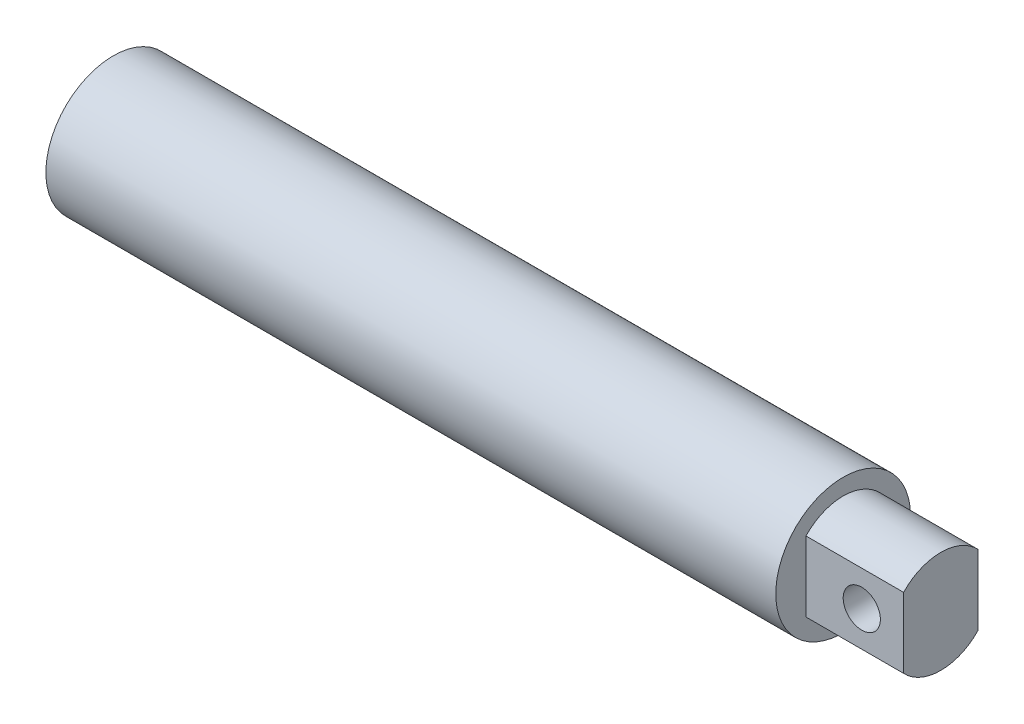
ISO-10303-21;
HEADER;
FILE_DESCRIPTION(('STEP AP214'),'2;1');
FILE_NAME('part.step','',(''),(''),'','','');
FILE_SCHEMA(('AUTOMOTIVE_DESIGN { 1 0 10303 214 1 1 1 1 }'));
ENDSEC;
DATA;
#1=APPLICATION_CONTEXT('core data for automotive mechanical design processes');
#2=APPLICATION_PROTOCOL_DEFINITION('international standard','automotive_design',2000,#1);
#3=PRODUCT_CONTEXT('',#1,'mechanical');
#4=PRODUCT('Part','Part','',(#3));
#5=PRODUCT_RELATED_PRODUCT_CATEGORY('part','',(#4));
#6=PRODUCT_DEFINITION_FORMATION('','',#4);
#7=PRODUCT_DEFINITION_CONTEXT('part definition',#1,'design');
#8=PRODUCT_DEFINITION('design','',#6,#7);
#9=PRODUCT_DEFINITION_SHAPE('','',#8);
#10=(LENGTH_UNIT() NAMED_UNIT(*) SI_UNIT(.MILLI.,.METRE.));
#11=(NAMED_UNIT(*) PLANE_ANGLE_UNIT() SI_UNIT($,.RADIAN.));
#12=(NAMED_UNIT(*) SI_UNIT($,.STERADIAN.) SOLID_ANGLE_UNIT());
#13=UNCERTAINTY_MEASURE_WITH_UNIT(LENGTH_MEASURE(1.E-05),#10,'distance_accuracy_value','');
#14=(GEOMETRIC_REPRESENTATION_CONTEXT(3) GLOBAL_UNCERTAINTY_ASSIGNED_CONTEXT((#13)) GLOBAL_UNIT_ASSIGNED_CONTEXT((#10,
#11,#12)) REPRESENTATION_CONTEXT('',''));
#15=CARTESIAN_POINT('',(0.,0.,0.));
#16=DIRECTION('',(0.,0.,1.));
#17=DIRECTION('',(1.,0.,0.));
#18=AXIS2_PLACEMENT_3D('',#15,#16,#17);
#19=CARTESIAN_POINT('',(157.,0.,0.));
#20=DIRECTION('',(1.,0.,0.));
#21=DIRECTION('',(0.,0.,-1.));
#22=AXIS2_PLACEMENT_3D('',#19,#20,#21);
#23=PLANE('',#22);
#24=CARTESIAN_POINT('',(157.,0.,0.));
#25=DIRECTION('',(1.,0.,0.));
#26=DIRECTION('',(0.,0.,-1.));
#27=AXIS2_PLACEMENT_3D('',#24,#25,#26);
#28=CIRCLE('',#27,14.5);
#29=CARTESIAN_POINT('',(157.,0.,-14.5));
#30=VERTEX_POINT('',#29);
#31=EDGE_CURVE('E11',#30,#30,#28,.T.);
#32=ORIENTED_EDGE('',*,*,#31,.T.);
#33=EDGE_LOOP('',(#32));
#34=FACE_BOUND('',#33,.T.);
#35=DIRECTION('',(0.,1.,0.));
#36=VECTOR('',#35,1.);
#37=CARTESIAN_POINT('',(157.,-7.54983443527074,-8.));
#38=LINE('',#37,#36);
#39=CARTESIAN_POINT('',(157.,-7.54983443527074,-8.));
#40=VERTEX_POINT('',#39);
#41=CARTESIAN_POINT('',(157.,7.54983443527074,-8.));
#42=VERTEX_POINT('',#41);
#43=EDGE_CURVE('E91',#40,#42,#38,.T.);
#44=ORIENTED_EDGE('',*,*,#43,.F.);
#45=CARTESIAN_POINT('',(157.,0.,0.));
#46=DIRECTION('',(1.,0.,0.));
#47=DIRECTION('',(0.,0.,-1.));
#48=AXIS2_PLACEMENT_3D('',#45,#46,#47);
#49=CIRCLE('',#48,11.);
#50=CARTESIAN_POINT('',(157.,-7.54983443527075,8.));
#51=VERTEX_POINT('',#50);
#52=EDGE_CURVE('E102',#51,#40,#49,.T.);
#53=ORIENTED_EDGE('',*,*,#52,.F.);
#54=DIRECTION('',(0.,-1.,0.));
#55=VECTOR('',#54,1.);
#56=CARTESIAN_POINT('',(157.,7.54983443527075,8.));
#57=LINE('',#56,#55);
#58=CARTESIAN_POINT('',(157.,7.54983443527075,8.));
#59=VERTEX_POINT('',#58);
#60=EDGE_CURVE('E72',#59,#51,#57,.T.);
#61=ORIENTED_EDGE('',*,*,#60,.F.);
#62=CARTESIAN_POINT('',(157.,0.,0.));
#63=DIRECTION('',(1.,0.,0.));
#64=DIRECTION('',(0.,0.,-1.));
#65=AXIS2_PLACEMENT_3D('',#62,#63,#64);
#66=CIRCLE('',#65,11.);
#67=EDGE_CURVE('E107',#42,#59,#66,.T.);
#68=ORIENTED_EDGE('',*,*,#67,.F.);
#69=EDGE_LOOP('',(#44,#53,#61,#68));
#70=FACE_BOUND('',#69,.T.);
#71=ADVANCED_FACE('F35',(#34,#70),#23,.T.);
#72=CARTESIAN_POINT('',(157.,0.,0.));
#73=DIRECTION('',(-1.,0.,0.));
#74=DIRECTION('',(0.,0.,1.));
#75=AXIS2_PLACEMENT_3D('',#72,#73,#74);
#76=CYLINDRICAL_SURFACE('',#75,14.5);
#77=ORIENTED_EDGE('',*,*,#31,.F.);
#78=EDGE_LOOP('',(#77));
#79=FACE_BOUND('',#78,.T.);
#80=CARTESIAN_POINT('',(0.,0.,0.));
#81=DIRECTION('',(1.,0.,0.));
#82=DIRECTION('',(0.,0.,-1.));
#83=AXIS2_PLACEMENT_3D('',#80,#81,#82);
#84=CIRCLE('',#83,14.5);
#85=CARTESIAN_POINT('',(0.,0.,-14.5));
#86=VERTEX_POINT('',#85);
#87=EDGE_CURVE('E39',#86,#86,#84,.T.);
#88=ORIENTED_EDGE('',*,*,#87,.T.);
#89=EDGE_LOOP('',(#88));
#90=FACE_BOUND('',#89,.T.);
#91=ADVANCED_FACE('F37',(#79,#90),#76,.T.);
#92=CARTESIAN_POINT('',(0.,0.,0.));
#93=DIRECTION('',(1.,0.,0.));
#94=DIRECTION('',(0.,0.,-1.));
#95=AXIS2_PLACEMENT_3D('',#92,#93,#94);
#96=PLANE('',#95);
#97=CARTESIAN_POINT('',(0.,0.,0.));
#98=DIRECTION('',(-1.,0.,0.));
#99=DIRECTION('',(0.,0.,1.));
#100=AXIS2_PLACEMENT_3D('',#97,#98,#99);
#101=CIRCLE('',#100,4.);
#102=CARTESIAN_POINT('',(0.,0.,4.));
#103=VERTEX_POINT('',#102);
#104=EDGE_CURVE('E163',#103,#103,#101,.T.);
#105=ORIENTED_EDGE('',*,*,#104,.F.);
#106=EDGE_LOOP('',(#105));
#107=FACE_BOUND('',#106,.T.);
#108=ORIENTED_EDGE('',*,*,#87,.F.);
#109=EDGE_LOOP('',(#108));
#110=FACE_BOUND('',#109,.T.);
#111=ADVANCED_FACE('F116',(#107,#110),#96,.F.);
#112=CARTESIAN_POINT('',(178.,0.,0.));
#113=DIRECTION('',(-1.,0.,0.));
#114=DIRECTION('',(0.,0.,1.));
#115=AXIS2_PLACEMENT_3D('',#112,#113,#114);
#116=CYLINDRICAL_SURFACE('',#115,11.);
#117=ORIENTED_EDGE('',*,*,#52,.T.);
#118=DIRECTION('',(-1.,0.,0.));
#119=VECTOR('',#118,1.);
#120=CARTESIAN_POINT('',(178.,-7.54983443527074,-8.));
#121=LINE('',#120,#119);
#122=CARTESIAN_POINT('',(178.,-7.54983443527074,-8.));
#123=VERTEX_POINT('',#122);
#124=EDGE_CURVE('E94',#123,#40,#121,.T.);
#125=ORIENTED_EDGE('',*,*,#124,.F.);
#126=CARTESIAN_POINT('',(178.,0.,0.));
#127=DIRECTION('',(1.,0.,0.));
#128=DIRECTION('',(0.,0.,-1.));
#129=AXIS2_PLACEMENT_3D('',#126,#127,#128);
#130=CIRCLE('',#129,11.);
#131=CARTESIAN_POINT('',(178.,-7.54983443527075,8.));
#132=VERTEX_POINT('',#131);
#133=EDGE_CURVE('E84',#132,#123,#130,.T.);
#134=ORIENTED_EDGE('',*,*,#133,.F.);
#135=DIRECTION('',(-1.,0.,0.));
#136=VECTOR('',#135,1.);
#137=CARTESIAN_POINT('',(178.,-7.54983443527075,8.));
#138=LINE('',#137,#136);
#139=EDGE_CURVE('E98',#132,#51,#138,.T.);
#140=ORIENTED_EDGE('',*,*,#139,.T.);
#141=EDGE_LOOP('',(#117,#125,#134,#140));
#142=FACE_BOUND('',#141,.T.);
#143=ADVANCED_FACE('F118',(#142),#116,.T.);
#144=CARTESIAN_POINT('',(178.,-7.54983443527074,-8.));
#145=DIRECTION('',(0.,0.,1.));
#146=DIRECTION('',(1.,0.,0.));
#147=AXIS2_PLACEMENT_3D('',#144,#145,#146);
#148=PLANE('',#147);
#149=CARTESIAN_POINT('',(169.,0.,-8.));
#150=DIRECTION('',(0.,0.,1.));
#151=DIRECTION('',(1.,0.,0.));
#152=AXIS2_PLACEMENT_3D('',#149,#150,#151);
#153=CIRCLE('',#152,3.99999999999999);
#154=CARTESIAN_POINT('',(173.,0.,-8.));
#155=VERTEX_POINT('',#154);
#156=EDGE_CURVE('E105',#155,#155,#153,.T.);
#157=ORIENTED_EDGE('',*,*,#156,.T.);
#158=EDGE_LOOP('',(#157));
#159=FACE_BOUND('',#158,.T.);
#160=ORIENTED_EDGE('',*,*,#43,.T.);
#161=DIRECTION('',(-1.,0.,0.));
#162=VECTOR('',#161,1.);
#163=CARTESIAN_POINT('',(178.,7.54983443527074,-8.));
#164=LINE('',#163,#162);
#165=CARTESIAN_POINT('',(178.,7.54983443527074,-8.));
#166=VERTEX_POINT('',#165);
#167=EDGE_CURVE('E88',#166,#42,#164,.T.);
#168=ORIENTED_EDGE('',*,*,#167,.F.);
#169=DIRECTION('',(0.,1.,0.));
#170=VECTOR('',#169,1.);
#171=CARTESIAN_POINT('',(178.,-7.54983443527074,-8.));
#172=LINE('',#171,#170);
#173=EDGE_CURVE('E79',#123,#166,#172,.T.);
#174=ORIENTED_EDGE('',*,*,#173,.F.);
#175=ORIENTED_EDGE('',*,*,#124,.T.);
#176=EDGE_LOOP('',(#160,#168,#174,#175));
#177=FACE_BOUND('',#176,.T.);
#178=ADVANCED_FACE('F89',(#159,#177),#148,.F.);
#179=CARTESIAN_POINT('',(178.,0.,0.));
#180=DIRECTION('',(-1.,0.,0.));
#181=DIRECTION('',(0.,0.,1.));
#182=AXIS2_PLACEMENT_3D('',#179,#180,#181);
#183=CYLINDRICAL_SURFACE('',#182,11.);
#184=ORIENTED_EDGE('',*,*,#67,.T.);
#185=DIRECTION('',(-1.,0.,0.));
#186=VECTOR('',#185,1.);
#187=CARTESIAN_POINT('',(178.,7.54983443527075,8.));
#188=LINE('',#187,#186);
#189=CARTESIAN_POINT('',(178.,7.54983443527075,8.));
#190=VERTEX_POINT('',#189);
#191=EDGE_CURVE('E50',#190,#59,#188,.T.);
#192=ORIENTED_EDGE('',*,*,#191,.F.);
#193=CARTESIAN_POINT('',(178.,0.,0.));
#194=DIRECTION('',(1.,0.,0.));
#195=DIRECTION('',(0.,0.,-1.));
#196=AXIS2_PLACEMENT_3D('',#193,#194,#195);
#197=CIRCLE('',#196,11.);
#198=EDGE_CURVE('E82',#166,#190,#197,.T.);
#199=ORIENTED_EDGE('',*,*,#198,.F.);
#200=ORIENTED_EDGE('',*,*,#167,.T.);
#201=EDGE_LOOP('',(#184,#192,#199,#200));
#202=FACE_BOUND('',#201,.T.);
#203=ADVANCED_FACE('F96',(#202),#183,.T.);
#204=CARTESIAN_POINT('',(178.,7.54983443527075,8.));
#205=DIRECTION('',(0.,0.,-1.));
#206=DIRECTION('',(-1.,0.,0.));
#207=AXIS2_PLACEMENT_3D('',#204,#205,#206);
#208=PLANE('',#207);
#209=CARTESIAN_POINT('',(169.,0.,8.));
#210=DIRECTION('',(0.,0.,1.));
#211=DIRECTION('',(1.,0.,0.));
#212=AXIS2_PLACEMENT_3D('',#209,#210,#211);
#213=CIRCLE('',#212,3.99999999999999);
#214=CARTESIAN_POINT('',(173.,0.,8.));
#215=VERTEX_POINT('',#214);
#216=EDGE_CURVE('E162',#215,#215,#213,.T.);
#217=ORIENTED_EDGE('',*,*,#216,.F.);
#218=EDGE_LOOP('',(#217));
#219=FACE_BOUND('',#218,.T.);
#220=ORIENTED_EDGE('',*,*,#60,.T.);
#221=ORIENTED_EDGE('',*,*,#139,.F.);
#222=DIRECTION('',(0.,-1.,0.));
#223=VECTOR('',#222,1.);
#224=CARTESIAN_POINT('',(178.,7.54983443527075,8.));
#225=LINE('',#224,#223);
#226=EDGE_CURVE('E58',#190,#132,#225,.T.);
#227=ORIENTED_EDGE('',*,*,#226,.F.);
#228=ORIENTED_EDGE('',*,*,#191,.T.);
#229=EDGE_LOOP('',(#220,#221,#227,#228));
#230=FACE_BOUND('',#229,.T.);
#231=ADVANCED_FACE('F140',(#219,#230),#208,.F.);
#232=CARTESIAN_POINT('',(178.,0.,0.));
#233=DIRECTION('',(1.,0.,0.));
#234=DIRECTION('',(0.,0.,-1.));
#235=AXIS2_PLACEMENT_3D('',#232,#233,#234);
#236=PLANE('',#235);
#237=ORIENTED_EDGE('',*,*,#133,.T.);
#238=ORIENTED_EDGE('',*,*,#173,.T.);
#239=ORIENTED_EDGE('',*,*,#198,.T.);
#240=ORIENTED_EDGE('',*,*,#226,.T.);
#241=EDGE_LOOP('',(#237,#238,#239,#240));
#242=FACE_BOUND('',#241,.T.);
#243=ADVANCED_FACE('F80',(#242),#236,.T.);
#244=CARTESIAN_POINT('',(169.,0.,-13.));
#245=DIRECTION('',(0.,0.,1.));
#246=DIRECTION('',(1.,0.,0.));
#247=AXIS2_PLACEMENT_3D('',#244,#245,#246);
#248=CYLINDRICAL_SURFACE('',#247,3.99999999999999);
#249=CARTESIAN_POINT('',(173.,0.,8.));
#250=CARTESIAN_POINT('',(173.,0.,7.83333333333333));
#251=CARTESIAN_POINT('',(173.,0.,7.66666666666667));
#252=CARTESIAN_POINT('',(173.,0.,7.33333333333333));
#253=CARTESIAN_POINT('',(173.,0.,7.16666666666667));
#254=CARTESIAN_POINT('',(173.,0.,6.83333333333333));
#255=CARTESIAN_POINT('',(173.,0.,6.66666666666667));
#256=CARTESIAN_POINT('',(173.,0.,6.33333333333333));
#257=CARTESIAN_POINT('',(173.,0.,6.16666666666667));
#258=CARTESIAN_POINT('',(173.,0.,5.83333333333333));
#259=CARTESIAN_POINT('',(173.,0.,5.66666666666667));
#260=CARTESIAN_POINT('',(173.,0.,5.33333333333333));
#261=CARTESIAN_POINT('',(173.,0.,5.16666666666667));
#262=CARTESIAN_POINT('',(173.,0.,4.83333333333333));
#263=CARTESIAN_POINT('',(173.,0.,4.66666666666667));
#264=CARTESIAN_POINT('',(173.,0.,4.33333333333333));
#265=CARTESIAN_POINT('',(173.,0.,4.16666666666667));
#266=CARTESIAN_POINT('',(173.,0.,3.83333333333333));
#267=CARTESIAN_POINT('',(173.,0.,3.66666666666666));
#268=CARTESIAN_POINT('',(173.,0.,3.33333333333333));
#269=CARTESIAN_POINT('',(173.,0.,3.16666666666666));
#270=CARTESIAN_POINT('',(173.,0.,2.83333333333333));
#271=CARTESIAN_POINT('',(173.,0.,2.66666666666667));
#272=CARTESIAN_POINT('',(173.,0.,2.33333333333334));
#273=CARTESIAN_POINT('',(173.,0.,2.16666666666667));
#274=CARTESIAN_POINT('',(173.,0.,1.83333333333334));
#275=CARTESIAN_POINT('',(173.,0.,1.66666666666667));
#276=CARTESIAN_POINT('',(173.,0.,1.33333333333333));
#277=CARTESIAN_POINT('',(173.,0.,1.16666666666667));
#278=CARTESIAN_POINT('',(173.,0.,0.833333333333334));
#279=CARTESIAN_POINT('',(173.,0.,0.666666666666667));
#280=CARTESIAN_POINT('',(173.,0.,0.333333333333334));
#281=CARTESIAN_POINT('',(173.,0.,0.166666666666667));
#282=CARTESIAN_POINT('',(173.,0.,-0.166666666666667));
#283=CARTESIAN_POINT('',(173.,0.,-0.333333333333334));
#284=CARTESIAN_POINT('',(173.,0.,-0.666666666666667));
#285=CARTESIAN_POINT('',(173.,0.,-0.833333333333334));
#286=CARTESIAN_POINT('',(173.,0.,-1.16666666666667));
#287=CARTESIAN_POINT('',(173.,0.,-1.33333333333333));
#288=CARTESIAN_POINT('',(173.,0.,-1.66666666666667));
#289=CARTESIAN_POINT('',(173.,0.,-1.83333333333334));
#290=CARTESIAN_POINT('',(173.,0.,-2.16666666666667));
#291=CARTESIAN_POINT('',(173.,0.,-2.33333333333333));
#292=CARTESIAN_POINT('',(173.,0.,-2.66666666666667));
#293=CARTESIAN_POINT('',(173.,0.,-2.83333333333333));
#294=CARTESIAN_POINT('',(173.,0.,-3.16666666666667));
#295=CARTESIAN_POINT('',(173.,0.,-3.33333333333333));
#296=CARTESIAN_POINT('',(173.,0.,-3.66666666666667));
#297=CARTESIAN_POINT('',(173.,0.,-3.83333333333333));
#298=CARTESIAN_POINT('',(173.,0.,-4.16666666666667));
#299=CARTESIAN_POINT('',(173.,0.,-4.33333333333334));
#300=CARTESIAN_POINT('',(173.,0.,-4.66666666666667));
#301=CARTESIAN_POINT('',(173.,0.,-4.83333333333334));
#302=CARTESIAN_POINT('',(173.,0.,-5.16666666666667));
#303=CARTESIAN_POINT('',(173.,0.,-5.33333333333334));
#304=CARTESIAN_POINT('',(173.,0.,-5.66666666666667));
#305=CARTESIAN_POINT('',(173.,0.,-5.83333333333333));
#306=CARTESIAN_POINT('',(173.,0.,-6.16666666666667));
#307=CARTESIAN_POINT('',(173.,0.,-6.33333333333333));
#308=CARTESIAN_POINT('',(173.,0.,-6.66666666666667));
#309=CARTESIAN_POINT('',(173.,0.,-6.83333333333334));
#310=CARTESIAN_POINT('',(173.,0.,-7.16666666666667));
#311=CARTESIAN_POINT('',(173.,0.,-7.33333333333334));
#312=CARTESIAN_POINT('',(173.,0.,-7.66666666666667));
#313=CARTESIAN_POINT('',(173.,0.,-7.83333333333334));
#314=CARTESIAN_POINT('',(173.,0.,-8.));
#315=B_SPLINE_CURVE_WITH_KNOTS('',3,(#249,#250,#251,#252,#253,#254,#255,#256,#257,#258,#259,
#260,#261,#262,#263,#264,#265,#266,#267,#268,#269,#270,#271,#272,#273,#274,#275,#276,#277,#278,
#279,#280,#281,#282,#283,#284,#285,#286,#287,#288,#289,#290,#291,#292,#293,#294,#295,#296,#297,
#298,#299,#300,#301,#302,#303,#304,#305,#306,#307,#308,#309,#310,#311,#312,#313,#314),
.UNSPECIFIED.,.F.,.F.,(4,2,2,2,2,2,2,2,2,2,2,2,2,2,2,2,2,2,2,2,2,2,2,2,2,2,2,2,2,2,2,2,4),(0.,
0.5,1.,1.5,2.,2.5,3.,3.5,4.,4.5,5.,5.5,6.,6.5,7.,7.5,8.,8.5,9.,9.5,10.,10.5,11.,11.5,12.,12.5,
13.,13.5,14.,14.5,15.,15.5,16.),.UNSPECIFIED.);
#316=EDGE_CURVE('BSEAM146',#215,#155,#315,.T.);
#317=ORIENTED_EDGE('',*,*,#216,.T.);
#318=ORIENTED_EDGE('',*,*,#156,.F.);
#319=ORIENTED_EDGE('',*,*,#316,.T.);
#320=ORIENTED_EDGE('',*,*,#316,.F.);
#321=EDGE_LOOP('',(#317,#319,#318,#320));
#322=FACE_BOUND('',#321,.T.);
#323=ADVANCED_FACE('F146',(#322),#248,.F.);
#324=CARTESIAN_POINT('',(80.,0.,0.));
#325=DIRECTION('',(-1.,0.,0.));
#326=DIRECTION('',(0.,0.,1.));
#327=AXIS2_PLACEMENT_3D('',#324,#325,#326);
#328=CYLINDRICAL_SURFACE('',#327,4.);
#329=CARTESIAN_POINT('',(80.,0.,0.));
#330=DIRECTION('',(-1.,0.,0.));
#331=DIRECTION('',(0.,0.,1.));
#332=AXIS2_PLACEMENT_3D('',#329,#330,#331);
#333=CIRCLE('',#332,4.);
#334=CARTESIAN_POINT('',(80.,0.,4.));
#335=VERTEX_POINT('',#334);
#336=EDGE_CURVE('E161',#335,#335,#333,.T.);
#337=ORIENTED_EDGE('',*,*,#336,.F.);
#338=EDGE_LOOP('',(#337));
#339=FACE_BOUND('',#338,.T.);
#340=ORIENTED_EDGE('',*,*,#104,.T.);
#341=EDGE_LOOP('',(#340));
#342=FACE_BOUND('',#341,.T.);
#343=ADVANCED_FACE('F149',(#339,#342),#328,.F.);
#344=CARTESIAN_POINT('',(80.,0.,0.));
#345=DIRECTION('',(-1.,0.,0.));
#346=DIRECTION('',(0.,0.,1.));
#347=AXIS2_PLACEMENT_3D('',#344,#345,#346);
#348=PLANE('',#347);
#349=ORIENTED_EDGE('',*,*,#336,.T.);
#350=EDGE_LOOP('',(#349));
#351=FACE_BOUND('',#350,.T.);
#352=ADVANCED_FACE('F153',(#351),#348,.T.);
#353=CLOSED_SHELL('',(#71,#91,#111,#143,#178,#203,#231,#243,#323,#343,#352));
#354=MANIFOLD_SOLID_BREP('B2',#353);
#355=ADVANCED_BREP_SHAPE_REPRESENTATION('',(#18,#354),#14);
#356=SHAPE_DEFINITION_REPRESENTATION(#9,#355);
ENDSEC;
END-ISO-10303-21;
